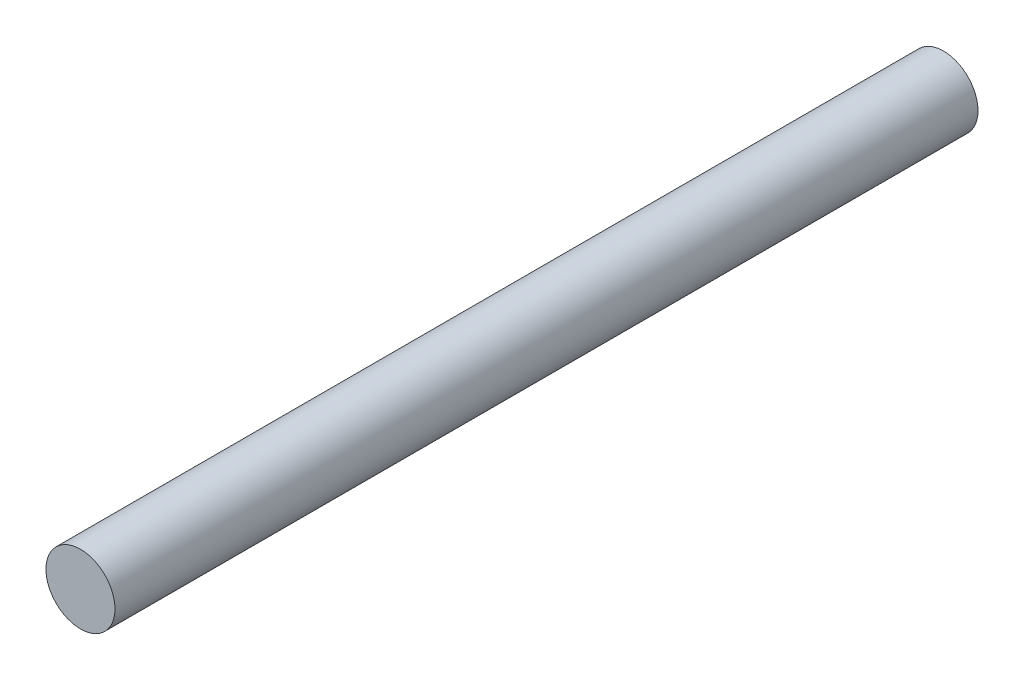
ISO-10303-21;
HEADER;
FILE_DESCRIPTION(('STEP AP214'),'2;1');
FILE_NAME('part.step','',(''),(''),'','','');
FILE_SCHEMA(('AUTOMOTIVE_DESIGN { 1 0 10303 214 1 1 1 1 }'));
ENDSEC;
DATA;
#1=APPLICATION_CONTEXT('core data for automotive mechanical design processes');
#2=APPLICATION_PROTOCOL_DEFINITION('international standard','automotive_design',2000,#1);
#3=PRODUCT_CONTEXT('',#1,'mechanical');
#4=PRODUCT('Part','Part','',(#3));
#5=PRODUCT_RELATED_PRODUCT_CATEGORY('part','',(#4));
#6=PRODUCT_DEFINITION_FORMATION('','',#4);
#7=PRODUCT_DEFINITION_CONTEXT('part definition',#1,'design');
#8=PRODUCT_DEFINITION('design','',#6,#7);
#9=PRODUCT_DEFINITION_SHAPE('','',#8);
#10=(LENGTH_UNIT() NAMED_UNIT(*) SI_UNIT(.MILLI.,.METRE.));
#11=(NAMED_UNIT(*) PLANE_ANGLE_UNIT() SI_UNIT($,.RADIAN.));
#12=(NAMED_UNIT(*) SI_UNIT($,.STERADIAN.) SOLID_ANGLE_UNIT());
#13=UNCERTAINTY_MEASURE_WITH_UNIT(LENGTH_MEASURE(1.E-05),#10,'distance_accuracy_value','');
#14=(GEOMETRIC_REPRESENTATION_CONTEXT(3) GLOBAL_UNCERTAINTY_ASSIGNED_CONTEXT((#13)) GLOBAL_UNIT_ASSIGNED_CONTEXT((#10,
#11,#12)) REPRESENTATION_CONTEXT('',''));
#15=CARTESIAN_POINT('',(0.,0.,0.));
#16=DIRECTION('',(0.,0.,1.));
#17=DIRECTION('',(1.,0.,0.));
#18=AXIS2_PLACEMENT_3D('',#15,#16,#17);
#19=CARTESIAN_POINT('',(0.,0.,-100.));
#20=DIRECTION('',(0.,0.,1.));
#21=DIRECTION('',(1.,0.,0.));
#22=AXIS2_PLACEMENT_3D('',#19,#20,#21);
#23=CYLINDRICAL_SURFACE('',#22,4.);
#24=CARTESIAN_POINT('',(0.,0.,-100.));
#25=DIRECTION('',(0.,0.,1.));
#26=DIRECTION('',(1.,0.,0.));
#27=AXIS2_PLACEMENT_3D('',#24,#25,#26);
#28=CIRCLE('',#27,4.);
#29=CARTESIAN_POINT('',(4.,0.,-100.));
#30=VERTEX_POINT('',#29);
#31=EDGE_CURVE('E10',#30,#30,#28,.T.);
#32=ORIENTED_EDGE('',*,*,#31,.T.);
#33=EDGE_LOOP('',(#32));
#34=FACE_BOUND('',#33,.T.);
#35=CARTESIAN_POINT('',(0.,0.,0.));
#36=DIRECTION('',(0.,0.,1.));
#37=DIRECTION('',(1.,0.,0.));
#38=AXIS2_PLACEMENT_3D('',#35,#36,#37);
#39=CIRCLE('',#38,4.);
#40=CARTESIAN_POINT('',(4.,0.,0.));
#41=VERTEX_POINT('',#40);
#42=EDGE_CURVE('E40',#41,#41,#39,.T.);
#43=ORIENTED_EDGE('',*,*,#42,.F.);
#44=EDGE_LOOP('',(#43));
#45=FACE_BOUND('',#44,.T.);
#46=ADVANCED_FACE('F37',(#34,#45),#23,.T.);
#47=CARTESIAN_POINT('',(0.,0.,-100.));
#48=DIRECTION('',(0.,0.,1.));
#49=DIRECTION('',(1.,0.,0.));
#50=AXIS2_PLACEMENT_3D('',#47,#48,#49);
#51=PLANE('',#50);
#52=ORIENTED_EDGE('',*,*,#31,.F.);
#53=EDGE_LOOP('',(#52));
#54=FACE_BOUND('',#53,.T.);
#55=ADVANCED_FACE('F54',(#54),#51,.F.);
#56=CARTESIAN_POINT('',(0.,0.,0.));
#57=DIRECTION('',(0.,0.,1.));
#58=DIRECTION('',(1.,0.,0.));
#59=AXIS2_PLACEMENT_3D('',#56,#57,#58);
#60=PLANE('',#59);
#61=ORIENTED_EDGE('',*,*,#42,.T.);
#62=EDGE_LOOP('',(#61));
#63=FACE_BOUND('',#62,.T.);
#64=ADVANCED_FACE('F51',(#63),#60,.T.);
#65=CLOSED_SHELL('',(#46,#55,#64));
#66=MANIFOLD_SOLID_BREP('B2',#65);
#67=ADVANCED_BREP_SHAPE_REPRESENTATION('',(#18,#66),#14);
#68=SHAPE_DEFINITION_REPRESENTATION(#9,#67);
ENDSEC;
END-ISO-10303-21;
